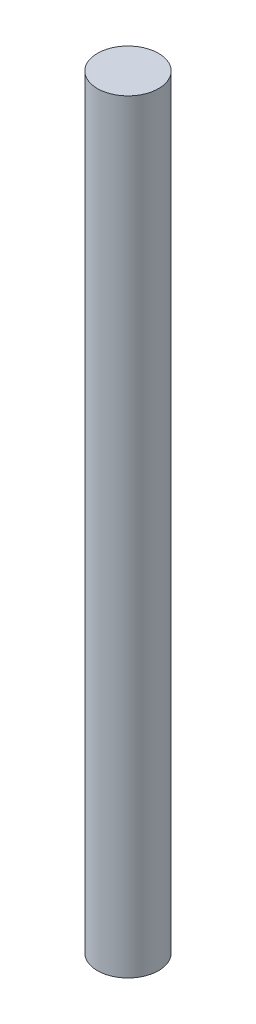
ISO-10303-21;
HEADER;
FILE_DESCRIPTION(('STEP AP214'),'2;1');
FILE_NAME('part.step','',(''),(''),'','','');
FILE_SCHEMA(('AUTOMOTIVE_DESIGN { 1 0 10303 214 1 1 1 1 }'));
ENDSEC;
DATA;
#1=APPLICATION_CONTEXT('core data for automotive mechanical design processes');
#2=APPLICATION_PROTOCOL_DEFINITION('international standard','automotive_design',2000,#1);
#3=PRODUCT_CONTEXT('',#1,'mechanical');
#4=PRODUCT('Part','Part','',(#3));
#5=PRODUCT_RELATED_PRODUCT_CATEGORY('part','',(#4));
#6=PRODUCT_DEFINITION_FORMATION('','',#4);
#7=PRODUCT_DEFINITION_CONTEXT('part definition',#1,'design');
#8=PRODUCT_DEFINITION('design','',#6,#7);
#9=PRODUCT_DEFINITION_SHAPE('','',#8);
#10=(LENGTH_UNIT() NAMED_UNIT(*) SI_UNIT(.MILLI.,.METRE.));
#11=(NAMED_UNIT(*) PLANE_ANGLE_UNIT() SI_UNIT($,.RADIAN.));
#12=(NAMED_UNIT(*) SI_UNIT($,.STERADIAN.) SOLID_ANGLE_UNIT());
#13=UNCERTAINTY_MEASURE_WITH_UNIT(LENGTH_MEASURE(1.E-05),#10,'distance_accuracy_value','');
#14=(GEOMETRIC_REPRESENTATION_CONTEXT(3) GLOBAL_UNCERTAINTY_ASSIGNED_CONTEXT((#13)) GLOBAL_UNIT_ASSIGNED_CONTEXT((#10,
#11,#12)) REPRESENTATION_CONTEXT('',''));
#15=CARTESIAN_POINT('',(0.,0.,0.));
#16=DIRECTION('',(0.,0.,1.));
#17=DIRECTION('',(1.,0.,0.));
#18=AXIS2_PLACEMENT_3D('',#15,#16,#17);
#19=CARTESIAN_POINT('',(-0.0277590215245657,12.7,0.));
#20=DIRECTION('',(0.,-1.,0.));
#21=DIRECTION('',(0.,0.,-1.));
#22=AXIS2_PLACEMENT_3D('',#19,#20,#21);
#23=CYLINDRICAL_SURFACE('',#22,0.508);
#24=CARTESIAN_POINT('',(-0.0277590215245657,12.7,0.));
#25=DIRECTION('',(0.,1.,0.));
#26=DIRECTION('',(0.,0.,1.));
#27=AXIS2_PLACEMENT_3D('',#24,#25,#26);
#28=CIRCLE('',#27,0.508);
#29=CARTESIAN_POINT('',(-0.0277590215245657,12.7,0.508));
#30=VERTEX_POINT('',#29);
#31=EDGE_CURVE('E10',#30,#30,#28,.T.);
#32=ORIENTED_EDGE('',*,*,#31,.F.);
#33=EDGE_LOOP('',(#32));
#34=FACE_BOUND('',#33,.T.);
#35=CARTESIAN_POINT('',(-0.0277590215245657,0.,0.));
#36=DIRECTION('',(0.,1.,0.));
#37=DIRECTION('',(0.,0.,1.));
#38=AXIS2_PLACEMENT_3D('',#35,#36,#37);
#39=CIRCLE('',#38,0.508);
#40=CARTESIAN_POINT('',(-0.0277590215245657,0.,0.508));
#41=VERTEX_POINT('',#40);
#42=EDGE_CURVE('E42',#41,#41,#39,.T.);
#43=ORIENTED_EDGE('',*,*,#42,.T.);
#44=EDGE_LOOP('',(#43));
#45=FACE_BOUND('',#44,.T.);
#46=ADVANCED_FACE('F39',(#34,#45),#23,.T.);
#47=CARTESIAN_POINT('',(-0.0277590215245657,12.7,0.));
#48=DIRECTION('',(0.,1.,0.));
#49=DIRECTION('',(0.,0.,1.));
#50=AXIS2_PLACEMENT_3D('',#47,#48,#49);
#51=PLANE('',#50);
#52=ORIENTED_EDGE('',*,*,#31,.T.);
#53=EDGE_LOOP('',(#52));
#54=FACE_BOUND('',#53,.T.);
#55=ADVANCED_FACE('F54',(#54),#51,.T.);
#56=CARTESIAN_POINT('',(-0.0277590215245657,0.,0.));
#57=DIRECTION('',(0.,1.,0.));
#58=DIRECTION('',(0.,0.,1.));
#59=AXIS2_PLACEMENT_3D('',#56,#57,#58);
#60=PLANE('',#59);
#61=ORIENTED_EDGE('',*,*,#42,.F.);
#62=EDGE_LOOP('',(#61));
#63=FACE_BOUND('',#62,.T.);
#64=ADVANCED_FACE('F52',(#63),#60,.F.);
#65=CLOSED_SHELL('',(#46,#55,#64));
#66=MANIFOLD_SOLID_BREP('B2',#65);
#67=ADVANCED_BREP_SHAPE_REPRESENTATION('',(#18,#66),#14);
#68=SHAPE_DEFINITION_REPRESENTATION(#9,#67);
ENDSEC;
END-ISO-10303-21;
